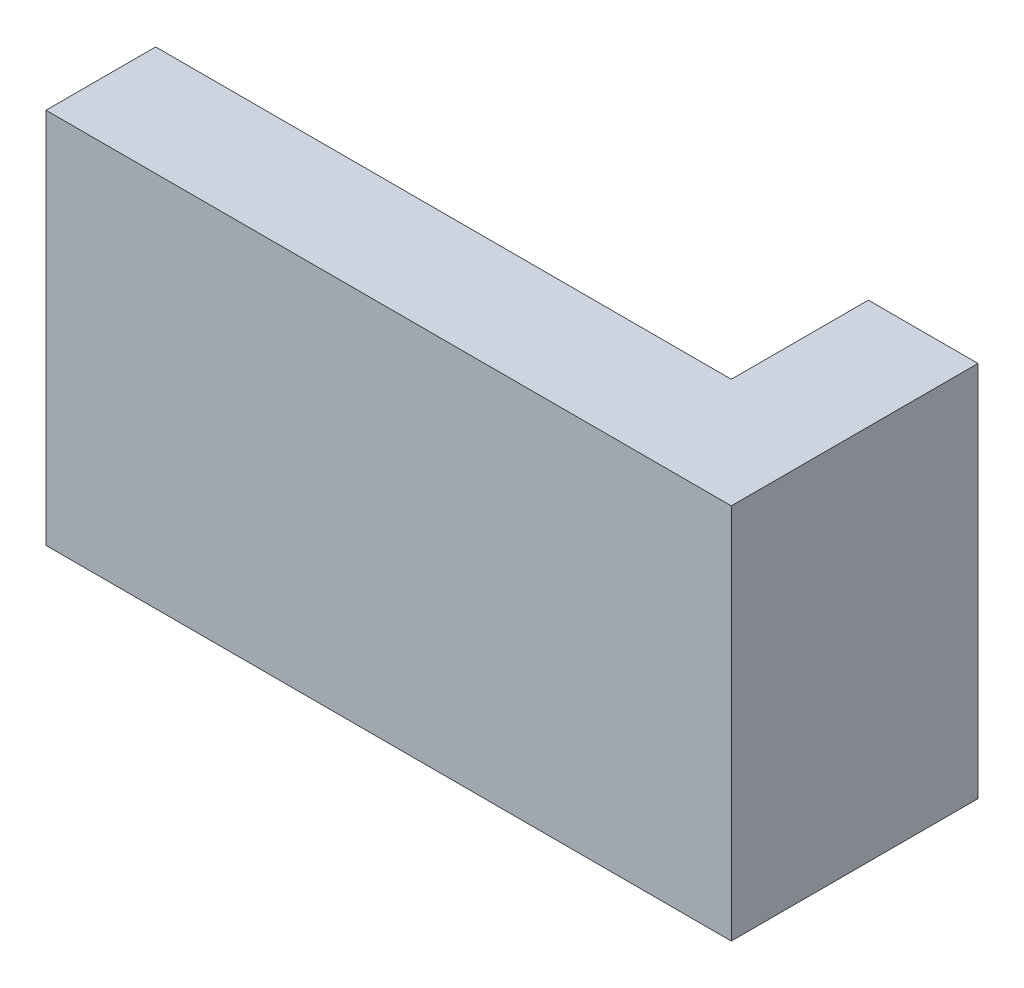
ISO-10303-21;
HEADER;
FILE_DESCRIPTION(('STEP AP214'),'2;1');
FILE_NAME('part.step','',(''),(''),'','','');
FILE_SCHEMA(('AUTOMOTIVE_DESIGN { 1 0 10303 214 1 1 1 1 }'));
ENDSEC;
DATA;
#1=APPLICATION_CONTEXT('core data for automotive mechanical design processes');
#2=APPLICATION_PROTOCOL_DEFINITION('international standard','automotive_design',2000,#1);
#3=PRODUCT_CONTEXT('',#1,'mechanical');
#4=PRODUCT('Part','Part','',(#3));
#5=PRODUCT_RELATED_PRODUCT_CATEGORY('part','',(#4));
#6=PRODUCT_DEFINITION_FORMATION('','',#4);
#7=PRODUCT_DEFINITION_CONTEXT('part definition',#1,'design');
#8=PRODUCT_DEFINITION('design','',#6,#7);
#9=PRODUCT_DEFINITION_SHAPE('','',#8);
#10=(LENGTH_UNIT() NAMED_UNIT(*) SI_UNIT(.MILLI.,.METRE.));
#11=(NAMED_UNIT(*) PLANE_ANGLE_UNIT() SI_UNIT($,.RADIAN.));
#12=(NAMED_UNIT(*) SI_UNIT($,.STERADIAN.) SOLID_ANGLE_UNIT());
#13=UNCERTAINTY_MEASURE_WITH_UNIT(LENGTH_MEASURE(1.E-05),#10,'distance_accuracy_value','');
#14=(GEOMETRIC_REPRESENTATION_CONTEXT(3) GLOBAL_UNCERTAINTY_ASSIGNED_CONTEXT((#13)) GLOBAL_UNIT_ASSIGNED_CONTEXT((#10,
#11,#12)) REPRESENTATION_CONTEXT('',''));
#15=CARTESIAN_POINT('',(0.,0.,0.));
#16=DIRECTION('',(0.,0.,1.));
#17=DIRECTION('',(1.,0.,0.));
#18=AXIS2_PLACEMENT_3D('',#15,#16,#17);
#19=CARTESIAN_POINT('',(0.,0.,0.));
#20=DIRECTION('',(0.,0.,1.));
#21=DIRECTION('',(1.,0.,0.));
#22=AXIS2_PLACEMENT_3D('',#19,#20,#21);
#23=PLANE('',#22);
#24=DIRECTION('',(0.,1.,0.));
#25=VECTOR('',#24,1.);
#26=CARTESIAN_POINT('',(-10.8125984251969,9.40944881889764,0.));
#27=LINE('',#26,#25);
#28=CARTESIAN_POINT('',(-10.8125984251969,3.90944881889764,0.));
#29=VERTEX_POINT('',#28);
#30=CARTESIAN_POINT('',(-10.8125984251969,9.40944881889764,0.));
#31=VERTEX_POINT('',#30);
#32=EDGE_CURVE('E54',#29,#31,#27,.T.);
#33=ORIENTED_EDGE('',*,*,#32,.F.);
#34=DIRECTION('',(1.,0.,0.));
#35=VECTOR('',#34,1.);
#36=CARTESIAN_POINT('',(-19.2125984251969,3.90944881889764,0.));
#37=LINE('',#36,#35);
#38=CARTESIAN_POINT('',(-19.2125984251969,3.90944881889764,0.));
#39=VERTEX_POINT('',#38);
#40=EDGE_CURVE('E138',#39,#29,#37,.T.);
#41=ORIENTED_EDGE('',*,*,#40,.F.);
#42=DIRECTION('',(0.,-1.,0.));
#43=VECTOR('',#42,1.);
#44=CARTESIAN_POINT('',(-19.2125984251969,9.40944881889764,0.));
#45=LINE('',#44,#43);
#46=CARTESIAN_POINT('',(-19.2125984251969,9.40944881889764,0.));
#47=VERTEX_POINT('',#46);
#48=EDGE_CURVE('E129',#47,#39,#45,.T.);
#49=ORIENTED_EDGE('',*,*,#48,.F.);
#50=DIRECTION('',(1.,0.,0.));
#51=VECTOR('',#50,1.);
#52=CARTESIAN_POINT('',(-19.2125984251969,9.40944881889764,0.));
#53=LINE('',#52,#51);
#54=EDGE_CURVE('E132',#47,#31,#53,.T.);
#55=ORIENTED_EDGE('',*,*,#54,.T.);
#56=EDGE_LOOP('',(#33,#41,#49,#55));
#57=FACE_BOUND('',#56,.T.);
#58=ADVANCED_FACE('F39',(#57),#23,.F.);
#59=CARTESIAN_POINT('',(-19.2125984251969,9.40944881889764,1.6));
#60=DIRECTION('',(1.,0.,0.));
#61=DIRECTION('',(0.,0.,-1.));
#62=AXIS2_PLACEMENT_3D('',#59,#60,#61);
#63=PLANE('',#62);
#64=ORIENTED_EDGE('',*,*,#48,.T.);
#65=DIRECTION('',(0.,0.,-1.));
#66=VECTOR('',#65,1.);
#67=CARTESIAN_POINT('',(-19.2125984251969,3.90944881889764,1.6));
#68=LINE('',#67,#66);
#69=CARTESIAN_POINT('',(-19.2125984251969,3.90944881889764,1.6));
#70=VERTEX_POINT('',#69);
#71=EDGE_CURVE('E11',#70,#39,#68,.T.);
#72=ORIENTED_EDGE('',*,*,#71,.F.);
#73=DIRECTION('',(0.,-1.,0.));
#74=VECTOR('',#73,1.);
#75=CARTESIAN_POINT('',(-19.2125984251969,9.40944881889764,1.6));
#76=LINE('',#75,#74);
#77=CARTESIAN_POINT('',(-19.2125984251969,9.40944881889764,1.6));
#78=VERTEX_POINT('',#77);
#79=EDGE_CURVE('E130',#78,#70,#76,.T.);
#80=ORIENTED_EDGE('',*,*,#79,.F.);
#81=DIRECTION('',(0.,0.,-1.));
#82=VECTOR('',#81,1.);
#83=CARTESIAN_POINT('',(-19.2125984251969,9.40944881889764,1.6));
#84=LINE('',#83,#82);
#85=EDGE_CURVE('E63',#78,#47,#84,.T.);
#86=ORIENTED_EDGE('',*,*,#85,.T.);
#87=EDGE_LOOP('',(#64,#72,#80,#86));
#88=FACE_BOUND('',#87,.T.);
#89=ADVANCED_FACE('F41',(#88),#63,.F.);
#90=CARTESIAN_POINT('',(-19.2125984251969,3.90944881889764,1.6));
#91=DIRECTION('',(0.,1.,0.));
#92=DIRECTION('',(0.,0.,1.));
#93=AXIS2_PLACEMENT_3D('',#90,#91,#92);
#94=PLANE('',#93);
#95=ORIENTED_EDGE('',*,*,#40,.T.);
#96=DIRECTION('',(0.,0.,1.));
#97=VECTOR('',#96,1.);
#98=CARTESIAN_POINT('',(-10.8125984251969,3.90944881889764,-2.));
#99=LINE('',#98,#97);
#100=CARTESIAN_POINT('',(-10.8125984251969,3.90944881889764,-2.));
#101=VERTEX_POINT('',#100);
#102=EDGE_CURVE('E111',#101,#29,#99,.T.);
#103=ORIENTED_EDGE('',*,*,#102,.F.);
#104=DIRECTION('',(-1.,0.,0.));
#105=VECTOR('',#104,1.);
#106=CARTESIAN_POINT('',(-9.21259842519685,3.90944881889764,-2.));
#107=LINE('',#106,#105);
#108=CARTESIAN_POINT('',(-9.21259842519685,3.90944881889764,-2.));
#109=VERTEX_POINT('',#108);
#110=EDGE_CURVE('E108',#109,#101,#107,.T.);
#111=ORIENTED_EDGE('',*,*,#110,.F.);
#112=DIRECTION('',(0.,0.,-1.));
#113=VECTOR('',#112,1.);
#114=CARTESIAN_POINT('',(-9.21259842519685,3.90944881889764,1.6));
#115=LINE('',#114,#113);
#116=CARTESIAN_POINT('',(-9.21259842519685,3.90944881889764,1.6));
#117=VERTEX_POINT('',#116);
#118=EDGE_CURVE('E47',#117,#109,#115,.T.);
#119=ORIENTED_EDGE('',*,*,#118,.F.);
#120=DIRECTION('',(1.,0.,0.));
#121=VECTOR('',#120,1.);
#122=CARTESIAN_POINT('',(-19.2125984251969,3.90944881889764,1.6));
#123=LINE('',#122,#121);
#124=EDGE_CURVE('E82',#70,#117,#123,.T.);
#125=ORIENTED_EDGE('',*,*,#124,.F.);
#126=ORIENTED_EDGE('',*,*,#71,.T.);
#127=EDGE_LOOP('',(#95,#103,#111,#119,#125,#126));
#128=FACE_BOUND('',#127,.T.);
#129=ADVANCED_FACE('F109',(#128),#94,.F.);
#130=CARTESIAN_POINT('',(-9.21259842519685,9.40944881889764,1.6));
#131=DIRECTION('',(1.,0.,0.));
#132=DIRECTION('',(0.,0.,-1.));
#133=AXIS2_PLACEMENT_3D('',#130,#131,#132);
#134=PLANE('',#133);
#135=ORIENTED_EDGE('',*,*,#118,.T.);
#136=DIRECTION('',(0.,-1.,0.));
#137=VECTOR('',#136,1.);
#138=CARTESIAN_POINT('',(-9.21259842519685,9.40944881889764,-2.));
#139=LINE('',#138,#137);
#140=CARTESIAN_POINT('',(-9.21259842519685,9.40944881889764,-2.));
#141=VERTEX_POINT('',#140);
#142=EDGE_CURVE('E103',#141,#109,#139,.T.);
#143=ORIENTED_EDGE('',*,*,#142,.F.);
#144=DIRECTION('',(0.,0.,-1.));
#145=VECTOR('',#144,1.);
#146=CARTESIAN_POINT('',(-9.21259842519685,9.40944881889764,1.6));
#147=LINE('',#146,#145);
#148=CARTESIAN_POINT('',(-9.21259842519685,9.40944881889764,1.6));
#149=VERTEX_POINT('',#148);
#150=EDGE_CURVE('E106',#149,#141,#147,.T.);
#151=ORIENTED_EDGE('',*,*,#150,.F.);
#152=DIRECTION('',(0.,-1.,0.));
#153=VECTOR('',#152,1.);
#154=CARTESIAN_POINT('',(-9.21259842519685,9.40944881889764,1.6));
#155=LINE('',#154,#153);
#156=EDGE_CURVE('E105',#149,#117,#155,.T.);
#157=ORIENTED_EDGE('',*,*,#156,.T.);
#158=EDGE_LOOP('',(#135,#143,#151,#157));
#159=FACE_BOUND('',#158,.T.);
#160=ADVANCED_FACE('F101',(#159),#134,.T.);
#161=CARTESIAN_POINT('',(-19.2125984251969,9.40944881889764,1.6));
#162=DIRECTION('',(0.,1.,0.));
#163=DIRECTION('',(0.,0.,1.));
#164=AXIS2_PLACEMENT_3D('',#161,#162,#163);
#165=PLANE('',#164);
#166=ORIENTED_EDGE('',*,*,#54,.F.);
#167=ORIENTED_EDGE('',*,*,#85,.F.);
#168=DIRECTION('',(1.,0.,0.));
#169=VECTOR('',#168,1.);
#170=CARTESIAN_POINT('',(-19.2125984251969,9.40944881889764,1.6));
#171=LINE('',#170,#169);
#172=EDGE_CURVE('E135',#78,#149,#171,.T.);
#173=ORIENTED_EDGE('',*,*,#172,.T.);
#174=ORIENTED_EDGE('',*,*,#150,.T.);
#175=DIRECTION('',(1.,0.,0.));
#176=VECTOR('',#175,1.);
#177=CARTESIAN_POINT('',(-9.21259842519685,9.40944881889764,-2.));
#178=LINE('',#177,#176);
#179=CARTESIAN_POINT('',(-10.8125984251969,9.40944881889764,-2.));
#180=VERTEX_POINT('',#179);
#181=EDGE_CURVE('E119',#180,#141,#178,.T.);
#182=ORIENTED_EDGE('',*,*,#181,.F.);
#183=DIRECTION('',(0.,0.,1.));
#184=VECTOR('',#183,1.);
#185=CARTESIAN_POINT('',(-10.8125984251969,9.40944881889764,-2.));
#186=LINE('',#185,#184);
#187=EDGE_CURVE('E124',#180,#31,#186,.T.);
#188=ORIENTED_EDGE('',*,*,#187,.T.);
#189=EDGE_LOOP('',(#166,#167,#173,#174,#182,#188));
#190=FACE_BOUND('',#189,.T.);
#191=ADVANCED_FACE('F142',(#190),#165,.T.);
#192=CARTESIAN_POINT('',(0.,0.,1.6));
#193=DIRECTION('',(0.,0.,1.));
#194=DIRECTION('',(1.,0.,0.));
#195=AXIS2_PLACEMENT_3D('',#192,#193,#194);
#196=PLANE('',#195);
#197=ORIENTED_EDGE('',*,*,#79,.T.);
#198=ORIENTED_EDGE('',*,*,#124,.T.);
#199=ORIENTED_EDGE('',*,*,#156,.F.);
#200=ORIENTED_EDGE('',*,*,#172,.F.);
#201=EDGE_LOOP('',(#197,#198,#199,#200));
#202=FACE_BOUND('',#201,.T.);
#203=ADVANCED_FACE('F145',(#202),#196,.T.);
#204=CARTESIAN_POINT('',(-10.8125984251969,9.40944881889764,-2.));
#205=DIRECTION('',(1.,0.,0.));
#206=DIRECTION('',(0.,0.,-1.));
#207=AXIS2_PLACEMENT_3D('',#204,#205,#206);
#208=PLANE('',#207);
#209=ORIENTED_EDGE('',*,*,#32,.T.);
#210=ORIENTED_EDGE('',*,*,#187,.F.);
#211=DIRECTION('',(0.,1.,0.));
#212=VECTOR('',#211,1.);
#213=CARTESIAN_POINT('',(-10.8125984251969,9.40944881889764,-2.));
#214=LINE('',#213,#212);
#215=EDGE_CURVE('E114',#101,#180,#214,.T.);
#216=ORIENTED_EDGE('',*,*,#215,.F.);
#217=ORIENTED_EDGE('',*,*,#102,.T.);
#218=EDGE_LOOP('',(#209,#210,#216,#217));
#219=FACE_BOUND('',#218,.T.);
#220=ADVANCED_FACE('F148',(#219),#208,.F.);
#221=CARTESIAN_POINT('',(0.,0.,-2.));
#222=DIRECTION('',(0.,0.,-1.));
#223=DIRECTION('',(-1.,0.,0.));
#224=AXIS2_PLACEMENT_3D('',#221,#222,#223);
#225=PLANE('',#224);
#226=ORIENTED_EDGE('',*,*,#142,.T.);
#227=ORIENTED_EDGE('',*,*,#110,.T.);
#228=ORIENTED_EDGE('',*,*,#215,.T.);
#229=ORIENTED_EDGE('',*,*,#181,.T.);
#230=EDGE_LOOP('',(#226,#227,#228,#229));
#231=FACE_BOUND('',#230,.T.);
#232=ADVANCED_FACE('F117',(#231),#225,.T.);
#233=CLOSED_SHELL('',(#58,#89,#129,#160,#191,#203,#220,#232));
#234=MANIFOLD_SOLID_BREP('B2',#233);
#235=ADVANCED_BREP_SHAPE_REPRESENTATION('',(#18,#234),#14);
#236=SHAPE_DEFINITION_REPRESENTATION(#9,#235);
ENDSEC;
END-ISO-10303-21;
